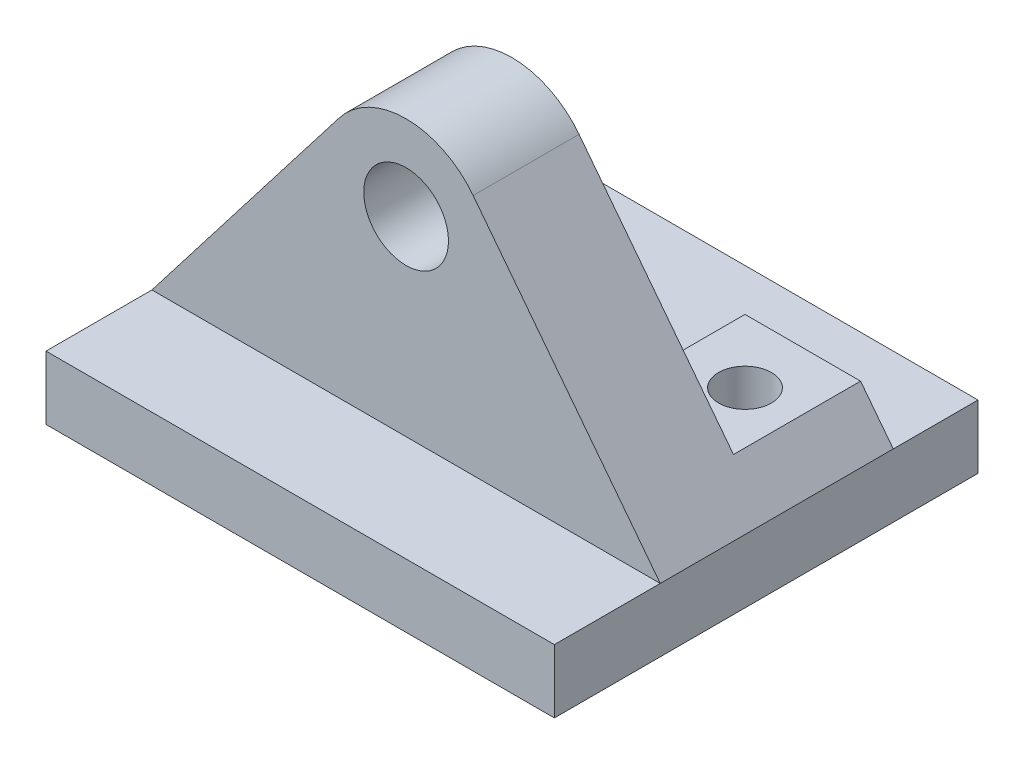
ISO-10303-21;
HEADER;
FILE_DESCRIPTION(('STEP AP214'),'2;1');
FILE_NAME('part.step','',(''),(''),'','','');
FILE_SCHEMA(('AUTOMOTIVE_DESIGN { 1 0 10303 214 1 1 1 1 }'));
ENDSEC;
DATA;
#1=APPLICATION_CONTEXT('core data for automotive mechanical design processes');
#2=APPLICATION_PROTOCOL_DEFINITION('international standard','automotive_design',2000,#1);
#3=PRODUCT_CONTEXT('',#1,'mechanical');
#4=PRODUCT('Part','Part','',(#3));
#5=PRODUCT_RELATED_PRODUCT_CATEGORY('part','',(#4));
#6=PRODUCT_DEFINITION_FORMATION('','',#4);
#7=PRODUCT_DEFINITION_CONTEXT('part definition',#1,'design');
#8=PRODUCT_DEFINITION('design','',#6,#7);
#9=PRODUCT_DEFINITION_SHAPE('','',#8);
#10=(LENGTH_UNIT() NAMED_UNIT(*) SI_UNIT(.MILLI.,.METRE.));
#11=(NAMED_UNIT(*) PLANE_ANGLE_UNIT() SI_UNIT($,.RADIAN.));
#12=(NAMED_UNIT(*) SI_UNIT($,.STERADIAN.) SOLID_ANGLE_UNIT());
#13=UNCERTAINTY_MEASURE_WITH_UNIT(LENGTH_MEASURE(1.E-05),#10,'distance_accuracy_value','');
#14=(GEOMETRIC_REPRESENTATION_CONTEXT(3) GLOBAL_UNCERTAINTY_ASSIGNED_CONTEXT((#13)) GLOBAL_UNIT_ASSIGNED_CONTEXT((#10,
#11,#12)) REPRESENTATION_CONTEXT('',''));
#15=CARTESIAN_POINT('',(0.,0.,0.));
#16=DIRECTION('',(0.,0.,1.));
#17=DIRECTION('',(1.,0.,0.));
#18=AXIS2_PLACEMENT_3D('',#15,#16,#17);
#19=CARTESIAN_POINT('',(12.,12.,15.));
#20=DIRECTION('',(0.,0.,1.));
#21=DIRECTION('',(1.,0.,0.));
#22=AXIS2_PLACEMENT_3D('',#19,#20,#21);
#23=PLANE('',#22);
#24=CARTESIAN_POINT('',(12.,12.,15.));
#25=DIRECTION('',(0.,0.,1.));
#26=DIRECTION('',(1.,0.,0.));
#27=AXIS2_PLACEMENT_3D('',#24,#25,#26);
#28=CIRCLE('',#27,2.);
#29=CARTESIAN_POINT('',(14.,12.,15.));
#30=VERTEX_POINT('',#29);
#31=EDGE_CURVE('E144',#30,#30,#28,.T.);
#32=ORIENTED_EDGE('',*,*,#31,.F.);
#33=EDGE_LOOP('',(#32));
#34=FACE_BOUND('',#33,.T.);
#35=DIRECTION('',(-0.611031055722718,-0.791606625125372,0.));
#36=VECTOR('',#35,1.);
#37=CARTESIAN_POINT('',(0.,3.,15.));
#38=LINE('',#37,#36);
#39=CARTESIAN_POINT('',(8.83357349949851,14.4441242228909,15.));
#40=VERTEX_POINT('',#39);
#41=CARTESIAN_POINT('',(0.,3.,15.));
#42=VERTEX_POINT('',#41);
#43=EDGE_CURVE('E190',#40,#42,#38,.T.);
#44=ORIENTED_EDGE('',*,*,#43,.T.);
#45=DIRECTION('',(1.,0.,0.));
#46=VECTOR('',#45,1.);
#47=CARTESIAN_POINT('',(0.,3.,15.));
#48=LINE('',#47,#46);
#49=CARTESIAN_POINT('',(24.,3.,15.));
#50=VERTEX_POINT('',#49);
#51=EDGE_CURVE('E251',#42,#50,#48,.T.);
#52=ORIENTED_EDGE('',*,*,#51,.T.);
#53=DIRECTION('',(-0.611031055722718,0.791606625125372,0.));
#54=VECTOR('',#53,1.);
#55=CARTESIAN_POINT('',(24.,3.,15.));
#56=LINE('',#55,#54);
#57=CARTESIAN_POINT('',(15.1664265005015,14.4441242228909,15.));
#58=VERTEX_POINT('',#57);
#59=EDGE_CURVE('E185',#50,#58,#56,.T.);
#60=ORIENTED_EDGE('',*,*,#59,.T.);
#61=CARTESIAN_POINT('',(12.,12.,15.));
#62=DIRECTION('',(0.,0.,1.));
#63=DIRECTION('',(1.,0.,0.));
#64=AXIS2_PLACEMENT_3D('',#61,#62,#63);
#65=CIRCLE('',#64,4.);
#66=EDGE_CURVE('E187',#58,#40,#65,.T.);
#67=ORIENTED_EDGE('',*,*,#66,.T.);
#68=EDGE_LOOP('',(#44,#52,#60,#67));
#69=FACE_BOUND('',#68,.T.);
#70=ADVANCED_FACE('F34',(#34,#69),#23,.T.);
#71=CARTESIAN_POINT('',(0.,26.7878320659349,10.));
#72=DIRECTION('',(0.,0.,1.));
#73=DIRECTION('',(0.,-1.,0.));
#74=AXIS2_PLACEMENT_3D('',#71,#72,#73);
#75=PLANE('',#74);
#76=CARTESIAN_POINT('',(12.,12.,10.));
#77=DIRECTION('',(0.,0.,1.));
#78=DIRECTION('',(0.,-1.,0.));
#79=AXIS2_PLACEMENT_3D('',#76,#77,#78);
#80=CIRCLE('',#79,2.);
#81=CARTESIAN_POINT('',(12.,10.,10.));
#82=VERTEX_POINT('',#81);
#83=EDGE_CURVE('E176',#82,#82,#80,.T.);
#84=ORIENTED_EDGE('',*,*,#83,.T.);
#85=EDGE_LOOP('',(#84));
#86=FACE_BOUND('',#85,.T.);
#87=DIRECTION('',(0.,-1.,0.));
#88=VECTOR('',#87,1.);
#89=CARTESIAN_POINT('',(7.,5.,9.99999999999999));
#90=LINE('',#89,#88);
#91=CARTESIAN_POINT('',(7.,5.,9.99999999999999));
#92=VERTEX_POINT('',#91);
#93=CARTESIAN_POINT('',(7.,3.,9.99999999999999));
#94=VERTEX_POINT('',#93);
#95=EDGE_CURVE('E163',#92,#94,#90,.T.);
#96=ORIENTED_EDGE('',*,*,#95,.F.);
#97=DIRECTION('',(1.,0.,0.));
#98=VECTOR('',#97,1.);
#99=CARTESIAN_POINT('',(0.,5.,9.99999999999999));
#100=LINE('',#99,#98);
#101=CARTESIAN_POINT('',(1.54377448679373,5.,9.99999999999999));
#102=VERTEX_POINT('',#101);
#103=EDGE_CURVE('E228',#102,#92,#100,.T.);
#104=ORIENTED_EDGE('',*,*,#103,.F.);
#105=DIRECTION('',(-0.611031055722718,-0.791606625125372,0.));
#106=VECTOR('',#105,1.);
#107=CARTESIAN_POINT('',(0.,3.,9.99999999999999));
#108=LINE('',#107,#106);
#109=CARTESIAN_POINT('',(8.83357349949851,14.4441242228909,10.));
#110=VERTEX_POINT('',#109);
#111=EDGE_CURVE('E178',#110,#102,#108,.T.);
#112=ORIENTED_EDGE('',*,*,#111,.F.);
#113=CARTESIAN_POINT('',(12.,12.,10.));
#114=DIRECTION('',(0.,0.,1.));
#115=DIRECTION('',(0.,-1.,0.));
#116=AXIS2_PLACEMENT_3D('',#113,#114,#115);
#117=CIRCLE('',#116,4.);
#118=CARTESIAN_POINT('',(15.1664265005015,14.4441242228909,10.));
#119=VERTEX_POINT('',#118);
#120=EDGE_CURVE('E142',#119,#110,#117,.T.);
#121=ORIENTED_EDGE('',*,*,#120,.F.);
#122=DIRECTION('',(-0.611031055722718,0.791606625125372,0.));
#123=VECTOR('',#122,1.);
#124=CARTESIAN_POINT('',(24.,3.,9.99999999999999));
#125=LINE('',#124,#123);
#126=CARTESIAN_POINT('',(22.4562255132063,5.,9.99999999999999));
#127=VERTEX_POINT('',#126);
#128=EDGE_CURVE('E135',#127,#119,#125,.T.);
#129=ORIENTED_EDGE('',*,*,#128,.F.);
#130=DIRECTION('',(1.,0.,0.));
#131=VECTOR('',#130,1.);
#132=CARTESIAN_POINT('',(24.,5.,9.99999999999999));
#133=LINE('',#132,#131);
#134=CARTESIAN_POINT('',(17.,5.,9.99999999999999));
#135=VERTEX_POINT('',#134);
#136=EDGE_CURVE('E56',#135,#127,#133,.T.);
#137=ORIENTED_EDGE('',*,*,#136,.F.);
#138=DIRECTION('',(0.,-1.,0.));
#139=VECTOR('',#138,1.);
#140=CARTESIAN_POINT('',(17.,5.,9.99999999999999));
#141=LINE('',#140,#139);
#142=CARTESIAN_POINT('',(17.,3.,9.99999999999999));
#143=VERTEX_POINT('',#142);
#144=EDGE_CURVE('E151',#135,#143,#141,.T.);
#145=ORIENTED_EDGE('',*,*,#144,.T.);
#146=DIRECTION('',(1.,0.,0.));
#147=VECTOR('',#146,1.);
#148=CARTESIAN_POINT('',(0.,3.,9.99999999999999));
#149=LINE('',#148,#147);
#150=EDGE_CURVE('E171',#94,#143,#149,.T.);
#151=ORIENTED_EDGE('',*,*,#150,.F.);
#152=EDGE_LOOP('',(#96,#104,#112,#121,#129,#137,#145,#151));
#153=FACE_BOUND('',#152,.T.);
#154=ADVANCED_FACE('F140',(#86,#153),#75,.F.);
#155=CARTESIAN_POINT('',(0.,3.,9.99999999999999));
#156=DIRECTION('',(0.,-1.,0.));
#157=DIRECTION('',(0.,0.,-1.));
#158=AXIS2_PLACEMENT_3D('',#155,#156,#157);
#159=PLANE('',#158);
#160=DIRECTION('',(0.,0.,-1.));
#161=VECTOR('',#160,1.);
#162=CARTESIAN_POINT('',(7.,3.,9.99999999999999));
#163=LINE('',#162,#161);
#164=CARTESIAN_POINT('',(7.,3.,3.99999999999999));
#165=VERTEX_POINT('',#164);
#166=EDGE_CURVE('E219',#94,#165,#163,.T.);
#167=ORIENTED_EDGE('',*,*,#166,.F.);
#168=ORIENTED_EDGE('',*,*,#150,.T.);
#169=DIRECTION('',(0.,0.,1.));
#170=VECTOR('',#169,1.);
#171=CARTESIAN_POINT('',(17.,3.,9.99999999999999));
#172=LINE('',#171,#170);
#173=CARTESIAN_POINT('',(17.,3.,3.99999999999999));
#174=VERTEX_POINT('',#173);
#175=EDGE_CURVE('E162',#174,#143,#172,.T.);
#176=ORIENTED_EDGE('',*,*,#175,.F.);
#177=DIRECTION('',(-1.,0.,0.));
#178=VECTOR('',#177,1.);
#179=CARTESIAN_POINT('',(24.,3.,3.99999999999999));
#180=LINE('',#179,#178);
#181=CARTESIAN_POINT('',(24.,3.,3.99999999999999));
#182=VERTEX_POINT('',#181);
#183=EDGE_CURVE('E159',#182,#174,#180,.T.);
#184=ORIENTED_EDGE('',*,*,#183,.F.);
#185=DIRECTION('',(0.,0.,-1.));
#186=VECTOR('',#185,1.);
#187=CARTESIAN_POINT('',(24.,3.,9.99999999999999));
#188=LINE('',#187,#186);
#189=CARTESIAN_POINT('',(24.,3.,0.));
#190=VERTEX_POINT('',#189);
#191=EDGE_CURVE('E168',#182,#190,#188,.T.);
#192=ORIENTED_EDGE('',*,*,#191,.T.);
#193=DIRECTION('',(1.,0.,0.));
#194=VECTOR('',#193,1.);
#195=CARTESIAN_POINT('',(0.,3.,0.));
#196=LINE('',#195,#194);
#197=CARTESIAN_POINT('',(0.,3.,0.));
#198=VERTEX_POINT('',#197);
#199=EDGE_CURVE('E173',#198,#190,#196,.T.);
#200=ORIENTED_EDGE('',*,*,#199,.F.);
#201=DIRECTION('',(0.,0.,-1.));
#202=VECTOR('',#201,1.);
#203=CARTESIAN_POINT('',(0.,3.,9.99999999999999));
#204=LINE('',#203,#202);
#205=CARTESIAN_POINT('',(0.,3.,3.99999999999999));
#206=VERTEX_POINT('',#205);
#207=EDGE_CURVE('E169',#206,#198,#204,.T.);
#208=ORIENTED_EDGE('',*,*,#207,.F.);
#209=DIRECTION('',(-1.,0.,0.));
#210=VECTOR('',#209,1.);
#211=CARTESIAN_POINT('',(0.,3.,3.99999999999999));
#212=LINE('',#211,#210);
#213=EDGE_CURVE('E237',#165,#206,#212,.T.);
#214=ORIENTED_EDGE('',*,*,#213,.F.);
#215=EDGE_LOOP('',(#167,#168,#176,#184,#192,#200,#208,#214));
#216=FACE_BOUND('',#215,.T.);
#217=ADVANCED_FACE('F267',(#216),#159,.F.);
#218=CARTESIAN_POINT('',(12.,12.,0.));
#219=DIRECTION('',(0.,0.,1.));
#220=DIRECTION('',(1.,0.,0.));
#221=AXIS2_PLACEMENT_3D('',#218,#219,#220);
#222=PLANE('',#221);
#223=DIRECTION('',(0.,-1.,0.));
#224=VECTOR('',#223,1.);
#225=CARTESIAN_POINT('',(0.,0.,0.));
#226=LINE('',#225,#224);
#227=CARTESIAN_POINT('',(0.,0.,0.));
#228=VERTEX_POINT('',#227);
#229=EDGE_CURVE('E184',#198,#228,#226,.T.);
#230=ORIENTED_EDGE('',*,*,#229,.F.);
#231=ORIENTED_EDGE('',*,*,#199,.T.);
#232=DIRECTION('',(0.,1.,0.));
#233=VECTOR('',#232,1.);
#234=CARTESIAN_POINT('',(24.,0.,0.));
#235=LINE('',#234,#233);
#236=CARTESIAN_POINT('',(24.,0.,0.));
#237=VERTEX_POINT('',#236);
#238=EDGE_CURVE('E188',#237,#190,#235,.T.);
#239=ORIENTED_EDGE('',*,*,#238,.F.);
#240=DIRECTION('',(1.,0.,0.));
#241=VECTOR('',#240,1.);
#242=CARTESIAN_POINT('',(0.,0.,0.));
#243=LINE('',#242,#241);
#244=EDGE_CURVE('E196',#228,#237,#243,.T.);
#245=ORIENTED_EDGE('',*,*,#244,.F.);
#246=EDGE_LOOP('',(#230,#231,#239,#245));
#247=FACE_BOUND('',#246,.T.);
#248=ADVANCED_FACE('F271',(#247),#222,.F.);
#249=CARTESIAN_POINT('',(0.,0.,15.));
#250=DIRECTION('',(1.,0.,0.));
#251=DIRECTION('',(0.,0.,-1.));
#252=AXIS2_PLACEMENT_3D('',#249,#250,#251);
#253=PLANE('',#252);
#254=DIRECTION('',(0.,0.,-1.));
#255=VECTOR('',#254,1.);
#256=CARTESIAN_POINT('',(0.,3.,15.));
#257=LINE('',#256,#255);
#258=EDGE_CURVE('E193',#42,#206,#257,.T.);
#259=ORIENTED_EDGE('',*,*,#258,.T.);
#260=ORIENTED_EDGE('',*,*,#207,.T.);
#261=ORIENTED_EDGE('',*,*,#229,.T.);
#262=DIRECTION('',(0.,0.,-1.));
#263=VECTOR('',#262,1.);
#264=CARTESIAN_POINT('',(0.,0.,15.));
#265=LINE('',#264,#263);
#266=CARTESIAN_POINT('',(0.,0.,20.));
#267=VERTEX_POINT('',#266);
#268=EDGE_CURVE('E211',#267,#228,#265,.T.);
#269=ORIENTED_EDGE('',*,*,#268,.F.);
#270=DIRECTION('',(0.,1.,0.));
#271=VECTOR('',#270,1.);
#272=CARTESIAN_POINT('',(0.,0.,20.));
#273=LINE('',#272,#271);
#274=CARTESIAN_POINT('',(0.,3.,20.));
#275=VERTEX_POINT('',#274);
#276=EDGE_CURVE('E253',#267,#275,#273,.T.);
#277=ORIENTED_EDGE('',*,*,#276,.T.);
#278=DIRECTION('',(0.,0.,-1.));
#279=VECTOR('',#278,1.);
#280=CARTESIAN_POINT('',(0.,3.,20.));
#281=LINE('',#280,#279);
#282=EDGE_CURVE('E342',#275,#42,#281,.T.);
#283=ORIENTED_EDGE('',*,*,#282,.T.);
#284=EDGE_LOOP('',(#259,#260,#261,#269,#277,#283));
#285=FACE_BOUND('',#284,.T.);
#286=ADVANCED_FACE('F36',(#285),#253,.F.);
#287=CARTESIAN_POINT('',(0.,0.,15.));
#288=DIRECTION('',(0.,1.,0.));
#289=DIRECTION('',(-1.,0.,0.));
#290=AXIS2_PLACEMENT_3D('',#287,#288,#289);
#291=PLANE('',#290);
#292=CARTESIAN_POINT('',(20.,0.,7.00000000000001));
#293=DIRECTION('',(0.,-1.,0.));
#294=DIRECTION('',(1.,0.,0.));
#295=AXIS2_PLACEMENT_3D('',#292,#293,#294);
#296=CIRCLE('',#295,1.25);
#297=CARTESIAN_POINT('',(21.25,0.,7.00000000000001));
#298=VERTEX_POINT('',#297);
#299=EDGE_CURVE('E223',#298,#298,#296,.T.);
#300=ORIENTED_EDGE('',*,*,#299,.F.);
#301=EDGE_LOOP('',(#300));
#302=FACE_BOUND('',#301,.T.);
#303=CARTESIAN_POINT('',(4.,0.,7.));
#304=DIRECTION('',(0.,-1.,0.));
#305=DIRECTION('',(1.,0.,0.));
#306=AXIS2_PLACEMENT_3D('',#303,#304,#305);
#307=CIRCLE('',#306,1.25);
#308=CARTESIAN_POINT('',(5.25,0.,7.));
#309=VERTEX_POINT('',#308);
#310=EDGE_CURVE('E220',#309,#309,#307,.T.);
#311=ORIENTED_EDGE('',*,*,#310,.F.);
#312=EDGE_LOOP('',(#311));
#313=FACE_BOUND('',#312,.T.);
#314=ORIENTED_EDGE('',*,*,#244,.T.);
#315=DIRECTION('',(0.,0.,-1.));
#316=VECTOR('',#315,1.);
#317=CARTESIAN_POINT('',(24.,0.,15.));
#318=LINE('',#317,#316);
#319=CARTESIAN_POINT('',(24.,0.,20.));
#320=VERTEX_POINT('',#319);
#321=EDGE_CURVE('E208',#320,#237,#318,.T.);
#322=ORIENTED_EDGE('',*,*,#321,.F.);
#323=DIRECTION('',(-1.,0.,0.));
#324=VECTOR('',#323,1.);
#325=CARTESIAN_POINT('',(0.,0.,20.));
#326=LINE('',#325,#324);
#327=EDGE_CURVE('E338',#320,#267,#326,.T.);
#328=ORIENTED_EDGE('',*,*,#327,.T.);
#329=ORIENTED_EDGE('',*,*,#268,.T.);
#330=EDGE_LOOP('',(#314,#322,#328,#329));
#331=FACE_BOUND('',#330,.T.);
#332=ADVANCED_FACE('F320',(#302,#313,#331),#291,.F.);
#333=CARTESIAN_POINT('',(24.,0.,15.));
#334=DIRECTION('',(-1.,0.,0.));
#335=DIRECTION('',(0.,0.,1.));
#336=AXIS2_PLACEMENT_3D('',#333,#334,#335);
#337=PLANE('',#336);
#338=ORIENTED_EDGE('',*,*,#191,.F.);
#339=DIRECTION('',(0.,0.,-1.));
#340=VECTOR('',#339,1.);
#341=CARTESIAN_POINT('',(24.,3.,15.));
#342=LINE('',#341,#340);
#343=EDGE_CURVE('E206',#50,#182,#342,.T.);
#344=ORIENTED_EDGE('',*,*,#343,.F.);
#345=DIRECTION('',(0.,0.,-1.));
#346=VECTOR('',#345,1.);
#347=CARTESIAN_POINT('',(24.,3.,20.));
#348=LINE('',#347,#346);
#349=CARTESIAN_POINT('',(24.,3.,20.));
#350=VERTEX_POINT('',#349);
#351=EDGE_CURVE('E260',#350,#50,#348,.T.);
#352=ORIENTED_EDGE('',*,*,#351,.F.);
#353=DIRECTION('',(0.,-1.,0.));
#354=VECTOR('',#353,1.);
#355=CARTESIAN_POINT('',(24.,0.,20.));
#356=LINE('',#355,#354);
#357=EDGE_CURVE('E333',#350,#320,#356,.T.);
#358=ORIENTED_EDGE('',*,*,#357,.T.);
#359=ORIENTED_EDGE('',*,*,#321,.T.);
#360=ORIENTED_EDGE('',*,*,#238,.T.);
#361=EDGE_LOOP('',(#338,#344,#352,#358,#359,#360));
#362=FACE_BOUND('',#361,.T.);
#363=ADVANCED_FACE('F258',(#362),#337,.F.);
#364=CARTESIAN_POINT('',(24.,3.,15.));
#365=DIRECTION('',(-0.791606625125372,-0.611031055722718,0.));
#366=DIRECTION('',(0.611031055722718,-0.791606625125372,0.));
#367=AXIS2_PLACEMENT_3D('',#364,#365,#366);
#368=PLANE('',#367);
#369=ORIENTED_EDGE('',*,*,#343,.T.);
#370=DIRECTION('',(0.611031055722718,-0.791606625125372,0.));
#371=VECTOR('',#370,1.);
#372=CARTESIAN_POINT('',(23.0326075362651,4.25328209788476,3.99999999999999));
#373=LINE('',#372,#371);
#374=CARTESIAN_POINT('',(22.4562255132063,5.,3.99999999999999));
#375=VERTEX_POINT('',#374);
#376=EDGE_CURVE('E48',#375,#182,#373,.T.);
#377=ORIENTED_EDGE('',*,*,#376,.F.);
#378=DIRECTION('',(0.,0.,1.));
#379=VECTOR('',#378,1.);
#380=CARTESIAN_POINT('',(22.4562255132063,5.,3.99999999999999));
#381=LINE('',#380,#379);
#382=EDGE_CURVE('E11',#375,#127,#381,.T.);
#383=ORIENTED_EDGE('',*,*,#382,.T.);
#384=ORIENTED_EDGE('',*,*,#128,.T.);
#385=DIRECTION('',(0.,0.,-1.));
#386=VECTOR('',#385,1.);
#387=CARTESIAN_POINT('',(15.1664265005015,14.4441242228909,15.));
#388=LINE('',#387,#386);
#389=EDGE_CURVE('E204',#58,#119,#388,.T.);
#390=ORIENTED_EDGE('',*,*,#389,.F.);
#391=ORIENTED_EDGE('',*,*,#59,.F.);
#392=EDGE_LOOP('',(#369,#377,#383,#384,#390,#391));
#393=FACE_BOUND('',#392,.T.);
#394=ADVANCED_FACE('F133',(#393),#368,.F.);
#395=CARTESIAN_POINT('',(12.,12.,15.));
#396=DIRECTION('',(0.,0.,-1.));
#397=DIRECTION('',(-1.,0.,0.));
#398=AXIS2_PLACEMENT_3D('',#395,#396,#397);
#399=CYLINDRICAL_SURFACE('',#398,4.);
#400=ORIENTED_EDGE('',*,*,#389,.T.);
#401=ORIENTED_EDGE('',*,*,#120,.T.);
#402=DIRECTION('',(0.,0.,-1.));
#403=VECTOR('',#402,1.);
#404=CARTESIAN_POINT('',(8.83357349949851,14.4441242228909,15.));
#405=LINE('',#404,#403);
#406=EDGE_CURVE('E201',#40,#110,#405,.T.);
#407=ORIENTED_EDGE('',*,*,#406,.F.);
#408=ORIENTED_EDGE('',*,*,#66,.F.);
#409=EDGE_LOOP('',(#400,#401,#407,#408));
#410=FACE_BOUND('',#409,.T.);
#411=ADVANCED_FACE('F245',(#410),#399,.T.);
#412=CARTESIAN_POINT('',(0.,3.,15.));
#413=DIRECTION('',(0.791606625125372,-0.611031055722718,0.));
#414=DIRECTION('',(0.611031055722718,0.791606625125372,0.));
#415=AXIS2_PLACEMENT_3D('',#412,#413,#414);
#416=PLANE('',#415);
#417=ORIENTED_EDGE('',*,*,#406,.T.);
#418=ORIENTED_EDGE('',*,*,#111,.T.);
#419=DIRECTION('',(0.,0.,1.));
#420=VECTOR('',#419,1.);
#421=CARTESIAN_POINT('',(1.54377448679373,5.,3.99999999999999));
#422=LINE('',#421,#420);
#423=CARTESIAN_POINT('',(1.54377448679373,5.,3.99999999999999));
#424=VERTEX_POINT('',#423);
#425=EDGE_CURVE('E42',#424,#102,#422,.T.);
#426=ORIENTED_EDGE('',*,*,#425,.F.);
#427=DIRECTION('',(0.611031055722718,0.791606625125371,0.));
#428=VECTOR('',#427,1.);
#429=CARTESIAN_POINT('',(0.967392463734907,4.25328209788476,3.99999999999999));
#430=LINE('',#429,#428);
#431=EDGE_CURVE('E254',#206,#424,#430,.T.);
#432=ORIENTED_EDGE('',*,*,#431,.F.);
#433=ORIENTED_EDGE('',*,*,#258,.F.);
#434=ORIENTED_EDGE('',*,*,#43,.F.);
#435=EDGE_LOOP('',(#417,#418,#426,#432,#433,#434));
#436=FACE_BOUND('',#435,.T.);
#437=ADVANCED_FACE('F239',(#436),#416,.F.);
#438=CARTESIAN_POINT('',(12.,12.,15.));
#439=DIRECTION('',(0.,0.,-1.));
#440=DIRECTION('',(-1.,0.,0.));
#441=AXIS2_PLACEMENT_3D('',#438,#439,#440);
#442=CYLINDRICAL_SURFACE('',#441,2.);
#443=ORIENTED_EDGE('',*,*,#83,.F.);
#444=EDGE_LOOP('',(#443));
#445=FACE_BOUND('',#444,.T.);
#446=ORIENTED_EDGE('',*,*,#31,.T.);
#447=EDGE_LOOP('',(#446));
#448=FACE_BOUND('',#447,.T.);
#449=ADVANCED_FACE('F298',(#445,#448),#442,.F.);
#450=CARTESIAN_POINT('',(24.,5.,3.99999999999999));
#451=DIRECTION('',(0.,0.,1.));
#452=DIRECTION('',(0.,-1.,0.));
#453=AXIS2_PLACEMENT_3D('',#450,#451,#452);
#454=PLANE('',#453);
#455=DIRECTION('',(-1.,0.,0.));
#456=VECTOR('',#455,1.);
#457=CARTESIAN_POINT('',(24.,5.,3.99999999999999));
#458=LINE('',#457,#456);
#459=CARTESIAN_POINT('',(17.,5.,3.99999999999999));
#460=VERTEX_POINT('',#459);
#461=EDGE_CURVE('E155',#375,#460,#458,.T.);
#462=ORIENTED_EDGE('',*,*,#461,.F.);
#463=ORIENTED_EDGE('',*,*,#376,.T.);
#464=ORIENTED_EDGE('',*,*,#183,.T.);
#465=DIRECTION('',(0.,-1.,0.));
#466=VECTOR('',#465,1.);
#467=CARTESIAN_POINT('',(17.,5.,3.99999999999999));
#468=LINE('',#467,#466);
#469=EDGE_CURVE('E153',#460,#174,#468,.T.);
#470=ORIENTED_EDGE('',*,*,#469,.F.);
#471=EDGE_LOOP('',(#462,#463,#464,#470));
#472=FACE_BOUND('',#471,.T.);
#473=ADVANCED_FACE('F287',(#472),#454,.F.);
#474=CARTESIAN_POINT('',(17.,5.,9.99999999999999));
#475=DIRECTION('',(1.,0.,0.));
#476=DIRECTION('',(0.,0.,-1.));
#477=AXIS2_PLACEMENT_3D('',#474,#475,#476);
#478=PLANE('',#477);
#479=ORIENTED_EDGE('',*,*,#175,.T.);
#480=ORIENTED_EDGE('',*,*,#144,.F.);
#481=DIRECTION('',(0.,0.,1.));
#482=VECTOR('',#481,1.);
#483=CARTESIAN_POINT('',(17.,5.,9.99999999999999));
#484=LINE('',#483,#482);
#485=EDGE_CURVE('E149',#460,#135,#484,.T.);
#486=ORIENTED_EDGE('',*,*,#485,.F.);
#487=ORIENTED_EDGE('',*,*,#469,.T.);
#488=EDGE_LOOP('',(#479,#480,#486,#487));
#489=FACE_BOUND('',#488,.T.);
#490=ADVANCED_FACE('F289',(#489),#478,.F.);
#491=CARTESIAN_POINT('',(24.,5.,3.99999999999999));
#492=DIRECTION('',(0.,1.,0.));
#493=DIRECTION('',(0.,0.,1.));
#494=AXIS2_PLACEMENT_3D('',#491,#492,#493);
#495=PLANE('',#494);
#496=ORIENTED_EDGE('',*,*,#382,.F.);
#497=ORIENTED_EDGE('',*,*,#461,.T.);
#498=ORIENTED_EDGE('',*,*,#485,.T.);
#499=ORIENTED_EDGE('',*,*,#136,.T.);
#500=EDGE_LOOP('',(#496,#497,#498,#499));
#501=FACE_BOUND('',#500,.T.);
#502=CARTESIAN_POINT('',(20.,5.,7.00000000000001));
#503=DIRECTION('',(0.,1.,0.));
#504=DIRECTION('',(0.,0.,1.));
#505=AXIS2_PLACEMENT_3D('',#502,#503,#504);
#506=CIRCLE('',#505,1.25);
#507=CARTESIAN_POINT('',(20.,5.,8.25000000000001));
#508=VERTEX_POINT('',#507);
#509=EDGE_CURVE('E221',#508,#508,#506,.T.);
#510=ORIENTED_EDGE('',*,*,#509,.F.);
#511=EDGE_LOOP('',(#510));
#512=FACE_BOUND('',#511,.T.);
#513=ADVANCED_FACE('F146',(#501,#512),#495,.T.);
#514=CARTESIAN_POINT('',(7.,5.,9.99999999999999));
#515=DIRECTION('',(-1.,0.,0.));
#516=DIRECTION('',(0.,0.,1.));
#517=AXIS2_PLACEMENT_3D('',#514,#515,#516);
#518=PLANE('',#517);
#519=ORIENTED_EDGE('',*,*,#166,.T.);
#520=DIRECTION('',(0.,-1.,0.));
#521=VECTOR('',#520,1.);
#522=CARTESIAN_POINT('',(7.,5.,3.99999999999999));
#523=LINE('',#522,#521);
#524=CARTESIAN_POINT('',(7.,5.,3.99999999999999));
#525=VERTEX_POINT('',#524);
#526=EDGE_CURVE('E283',#525,#165,#523,.T.);
#527=ORIENTED_EDGE('',*,*,#526,.F.);
#528=DIRECTION('',(0.,0.,-1.));
#529=VECTOR('',#528,1.);
#530=CARTESIAN_POINT('',(7.,5.,9.99999999999999));
#531=LINE('',#530,#529);
#532=EDGE_CURVE('E236',#92,#525,#531,.T.);
#533=ORIENTED_EDGE('',*,*,#532,.F.);
#534=ORIENTED_EDGE('',*,*,#95,.T.);
#535=EDGE_LOOP('',(#519,#527,#533,#534));
#536=FACE_BOUND('',#535,.T.);
#537=ADVANCED_FACE('F296',(#536),#518,.F.);
#538=CARTESIAN_POINT('',(0.,5.,3.99999999999999));
#539=DIRECTION('',(0.,0.,1.));
#540=DIRECTION('',(0.,-1.,0.));
#541=AXIS2_PLACEMENT_3D('',#538,#539,#540);
#542=PLANE('',#541);
#543=ORIENTED_EDGE('',*,*,#213,.T.);
#544=ORIENTED_EDGE('',*,*,#431,.T.);
#545=DIRECTION('',(-1.,0.,0.));
#546=VECTOR('',#545,1.);
#547=CARTESIAN_POINT('',(0.,5.,3.99999999999999));
#548=LINE('',#547,#546);
#549=EDGE_CURVE('E231',#525,#424,#548,.T.);
#550=ORIENTED_EDGE('',*,*,#549,.F.);
#551=ORIENTED_EDGE('',*,*,#526,.T.);
#552=EDGE_LOOP('',(#543,#544,#550,#551));
#553=FACE_BOUND('',#552,.T.);
#554=ADVANCED_FACE('F352',(#553),#542,.F.);
#555=CARTESIAN_POINT('',(0.,5.,3.99999999999999));
#556=DIRECTION('',(0.,-1.,0.));
#557=DIRECTION('',(0.,0.,-1.));
#558=AXIS2_PLACEMENT_3D('',#555,#556,#557);
#559=PLANE('',#558);
#560=CARTESIAN_POINT('',(4.,5.,7.));
#561=DIRECTION('',(0.,-1.,0.));
#562=DIRECTION('',(0.,0.,-1.));
#563=AXIS2_PLACEMENT_3D('',#560,#561,#562);
#564=CIRCLE('',#563,1.25);
#565=CARTESIAN_POINT('',(4.,5.,5.75));
#566=VERTEX_POINT('',#565);
#567=EDGE_CURVE('E216',#566,#566,#564,.T.);
#568=ORIENTED_EDGE('',*,*,#567,.T.);
#569=EDGE_LOOP('',(#568));
#570=FACE_BOUND('',#569,.T.);
#571=ORIENTED_EDGE('',*,*,#549,.T.);
#572=ORIENTED_EDGE('',*,*,#425,.T.);
#573=ORIENTED_EDGE('',*,*,#103,.T.);
#574=ORIENTED_EDGE('',*,*,#532,.T.);
#575=EDGE_LOOP('',(#571,#572,#573,#574));
#576=FACE_BOUND('',#575,.T.);
#577=ADVANCED_FACE('F227',(#570,#576),#559,.F.);
#578=CARTESIAN_POINT('',(4.,16.,7.));
#579=DIRECTION('',(0.,-1.,0.));
#580=DIRECTION('',(1.,0.,0.));
#581=AXIS2_PLACEMENT_3D('',#578,#579,#580);
#582=CYLINDRICAL_SURFACE('',#581,1.25);
#583=ORIENTED_EDGE('',*,*,#310,.T.);
#584=EDGE_LOOP('',(#583));
#585=FACE_BOUND('',#584,.T.);
#586=ORIENTED_EDGE('',*,*,#567,.F.);
#587=EDGE_LOOP('',(#586));
#588=FACE_BOUND('',#587,.T.);
#589=ADVANCED_FACE('F365',(#585,#588),#582,.F.);
#590=CARTESIAN_POINT('',(20.,16.,7.00000000000001));
#591=DIRECTION('',(0.,-1.,0.));
#592=DIRECTION('',(1.,0.,0.));
#593=AXIS2_PLACEMENT_3D('',#590,#591,#592);
#594=CYLINDRICAL_SURFACE('',#593,1.25);
#595=ORIENTED_EDGE('',*,*,#509,.T.);
#596=EDGE_LOOP('',(#595));
#597=FACE_BOUND('',#596,.T.);
#598=ORIENTED_EDGE('',*,*,#299,.T.);
#599=EDGE_LOOP('',(#598));
#600=FACE_BOUND('',#599,.T.);
#601=ADVANCED_FACE('F358',(#597,#600),#594,.F.);
#602=CARTESIAN_POINT('',(0.,3.,20.));
#603=DIRECTION('',(0.,1.,0.));
#604=DIRECTION('',(0.,0.,1.));
#605=AXIS2_PLACEMENT_3D('',#602,#603,#604);
#606=PLANE('',#605);
#607=ORIENTED_EDGE('',*,*,#51,.F.);
#608=ORIENTED_EDGE('',*,*,#282,.F.);
#609=DIRECTION('',(1.,0.,0.));
#610=VECTOR('',#609,1.);
#611=CARTESIAN_POINT('',(0.,3.,20.));
#612=LINE('',#611,#610);
#613=EDGE_CURVE('E339',#275,#350,#612,.T.);
#614=ORIENTED_EDGE('',*,*,#613,.T.);
#615=ORIENTED_EDGE('',*,*,#351,.T.);
#616=EDGE_LOOP('',(#607,#608,#614,#615));
#617=FACE_BOUND('',#616,.T.);
#618=ADVANCED_FACE('F356',(#617),#606,.T.);
#619=CARTESIAN_POINT('',(0.,3.,20.));
#620=DIRECTION('',(0.,0.,-1.));
#621=DIRECTION('',(-1.,0.,0.));
#622=AXIS2_PLACEMENT_3D('',#619,#620,#621);
#623=PLANE('',#622);
#624=ORIENTED_EDGE('',*,*,#276,.F.);
#625=ORIENTED_EDGE('',*,*,#327,.F.);
#626=ORIENTED_EDGE('',*,*,#357,.F.);
#627=ORIENTED_EDGE('',*,*,#613,.F.);
#628=EDGE_LOOP('',(#624,#625,#626,#627));
#629=FACE_BOUND('',#628,.T.);
#630=ADVANCED_FACE('F341',(#629),#623,.F.);
#631=CLOSED_SHELL('',(#70,#154,#217,#248,#286,#332,#363,#394,#411,#437,#449,#473,#490,#513,#537,
#554,#577,#589,#601,#618,#630));
#632=MANIFOLD_SOLID_BREP('B2',#631);
#633=ADVANCED_BREP_SHAPE_REPRESENTATION('',(#18,#632),#14);
#634=SHAPE_DEFINITION_REPRESENTATION(#9,#633);
ENDSEC;
END-ISO-10303-21;
